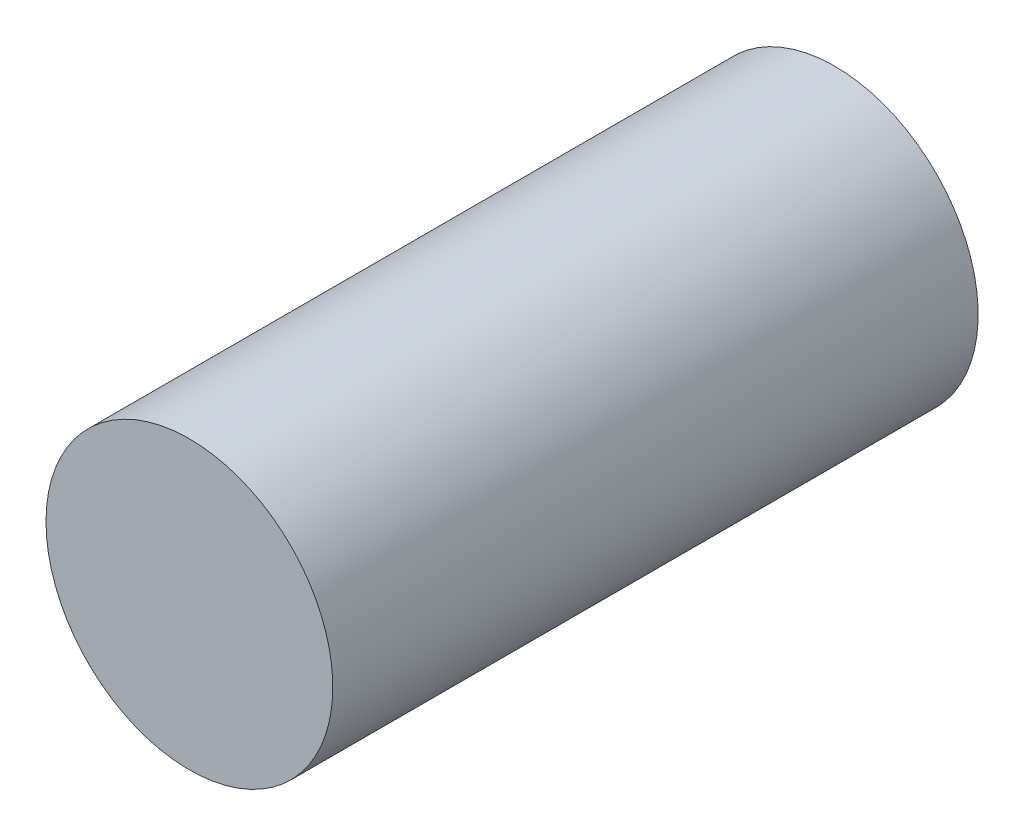
ISO-10303-21;
HEADER;
FILE_DESCRIPTION(('STEP AP214'),'2;1');
FILE_NAME('part.step','',(''),(''),'','','');
FILE_SCHEMA(('AUTOMOTIVE_DESIGN { 1 0 10303 214 1 1 1 1 }'));
ENDSEC;
DATA;
#1=APPLICATION_CONTEXT('core data for automotive mechanical design processes');
#2=APPLICATION_PROTOCOL_DEFINITION('international standard','automotive_design',2000,#1);
#3=PRODUCT_CONTEXT('',#1,'mechanical');
#4=PRODUCT('Part','Part','',(#3));
#5=PRODUCT_RELATED_PRODUCT_CATEGORY('part','',(#4));
#6=PRODUCT_DEFINITION_FORMATION('','',#4);
#7=PRODUCT_DEFINITION_CONTEXT('part definition',#1,'design');
#8=PRODUCT_DEFINITION('design','',#6,#7);
#9=PRODUCT_DEFINITION_SHAPE('','',#8);
#10=(LENGTH_UNIT() NAMED_UNIT(*) SI_UNIT(.MILLI.,.METRE.));
#11=(NAMED_UNIT(*) PLANE_ANGLE_UNIT() SI_UNIT($,.RADIAN.));
#12=(NAMED_UNIT(*) SI_UNIT($,.STERADIAN.) SOLID_ANGLE_UNIT());
#13=UNCERTAINTY_MEASURE_WITH_UNIT(LENGTH_MEASURE(1.E-05),#10,'distance_accuracy_value','');
#14=(GEOMETRIC_REPRESENTATION_CONTEXT(3) GLOBAL_UNCERTAINTY_ASSIGNED_CONTEXT((#13)) GLOBAL_UNIT_ASSIGNED_CONTEXT((#10,
#11,#12)) REPRESENTATION_CONTEXT('',''));
#15=CARTESIAN_POINT('',(0.,0.,0.));
#16=DIRECTION('',(0.,0.,1.));
#17=DIRECTION('',(1.,0.,0.));
#18=AXIS2_PLACEMENT_3D('',#15,#16,#17);
#19=CARTESIAN_POINT('',(0.,0.,45.));
#20=DIRECTION('',(0.,0.,-1.));
#21=DIRECTION('',(-1.,0.,0.));
#22=AXIS2_PLACEMENT_3D('',#19,#20,#21);
#23=CYLINDRICAL_SURFACE('',#22,10.);
#24=CARTESIAN_POINT('',(0.,0.,45.));
#25=DIRECTION('',(0.,0.,1.));
#26=DIRECTION('',(1.,0.,0.));
#27=AXIS2_PLACEMENT_3D('',#24,#25,#26);
#28=CIRCLE('',#27,10.);
#29=CARTESIAN_POINT('',(-10.,0.,45.));
#30=VERTEX_POINT('',#29);
#31=EDGE_CURVE('E10',#30,#30,#28,.T.);
#32=CARTESIAN_POINT('',(0.,0.,0.));
#33=DIRECTION('',(0.,0.,1.));
#34=DIRECTION('',(1.,0.,0.));
#35=AXIS2_PLACEMENT_3D('',#32,#33,#34);
#36=CIRCLE('',#35,10.);
#37=CARTESIAN_POINT('',(-10.,0.,0.));
#38=VERTEX_POINT('',#37);
#39=EDGE_CURVE('E46',#38,#38,#36,.T.);
#40=CARTESIAN_POINT('',(-10.,0.,45.));
#41=CARTESIAN_POINT('',(-10.,0.,44.53125));
#42=CARTESIAN_POINT('',(-10.,0.,44.0625));
#43=CARTESIAN_POINT('',(-10.,0.,43.125));
#44=CARTESIAN_POINT('',(-10.,0.,42.65625));
#45=CARTESIAN_POINT('',(-10.,0.,41.71875));
#46=CARTESIAN_POINT('',(-10.,0.,41.25));
#47=CARTESIAN_POINT('',(-10.,0.,40.3125));
#48=CARTESIAN_POINT('',(-10.,0.,39.84375));
#49=CARTESIAN_POINT('',(-10.,0.,38.90625));
#50=CARTESIAN_POINT('',(-10.,0.,38.4375));
#51=CARTESIAN_POINT('',(-10.,0.,37.5));
#52=CARTESIAN_POINT('',(-10.,0.,37.03125));
#53=CARTESIAN_POINT('',(-10.,0.,36.09375));
#54=CARTESIAN_POINT('',(-10.,0.,35.625));
#55=CARTESIAN_POINT('',(-10.,0.,34.6875));
#56=CARTESIAN_POINT('',(-10.,0.,34.21875));
#57=CARTESIAN_POINT('',(-10.,0.,33.28125));
#58=CARTESIAN_POINT('',(-10.,0.,32.8125));
#59=CARTESIAN_POINT('',(-10.,0.,31.875));
#60=CARTESIAN_POINT('',(-10.,0.,31.40625));
#61=CARTESIAN_POINT('',(-10.,0.,30.46875));
#62=CARTESIAN_POINT('',(-10.,0.,30.));
#63=CARTESIAN_POINT('',(-10.,0.,29.0625));
#64=CARTESIAN_POINT('',(-10.,0.,28.59375));
#65=CARTESIAN_POINT('',(-10.,0.,27.65625));
#66=CARTESIAN_POINT('',(-10.,0.,27.1875));
#67=CARTESIAN_POINT('',(-10.,0.,26.25));
#68=CARTESIAN_POINT('',(-10.,0.,25.78125));
#69=CARTESIAN_POINT('',(-10.,0.,24.84375));
#70=CARTESIAN_POINT('',(-10.,0.,24.375));
#71=CARTESIAN_POINT('',(-10.,0.,23.4375));
#72=CARTESIAN_POINT('',(-10.,0.,22.96875));
#73=CARTESIAN_POINT('',(-10.,0.,22.03125));
#74=CARTESIAN_POINT('',(-10.,0.,21.5625));
#75=CARTESIAN_POINT('',(-10.,0.,20.625));
#76=CARTESIAN_POINT('',(-10.,0.,20.15625));
#77=CARTESIAN_POINT('',(-10.,0.,19.21875));
#78=CARTESIAN_POINT('',(-10.,0.,18.75));
#79=CARTESIAN_POINT('',(-10.,0.,17.8125));
#80=CARTESIAN_POINT('',(-10.,0.,17.34375));
#81=CARTESIAN_POINT('',(-10.,0.,16.40625));
#82=CARTESIAN_POINT('',(-10.,0.,15.9375));
#83=CARTESIAN_POINT('',(-10.,0.,15.));
#84=CARTESIAN_POINT('',(-10.,0.,14.53125));
#85=CARTESIAN_POINT('',(-10.,0.,13.59375));
#86=CARTESIAN_POINT('',(-10.,0.,13.125));
#87=CARTESIAN_POINT('',(-10.,0.,12.1875));
#88=CARTESIAN_POINT('',(-10.,0.,11.71875));
#89=CARTESIAN_POINT('',(-10.,0.,10.78125));
#90=CARTESIAN_POINT('',(-10.,0.,10.3125));
#91=CARTESIAN_POINT('',(-10.,0.,9.375));
#92=CARTESIAN_POINT('',(-10.,0.,8.90625));
#93=CARTESIAN_POINT('',(-10.,0.,7.96874999999999));
#94=CARTESIAN_POINT('',(-10.,0.,7.5));
#95=CARTESIAN_POINT('',(-10.,0.,6.5625));
#96=CARTESIAN_POINT('',(-10.,0.,6.09375));
#97=CARTESIAN_POINT('',(-10.,0.,5.15625));
#98=CARTESIAN_POINT('',(-10.,0.,4.68749999999999));
#99=CARTESIAN_POINT('',(-10.,0.,3.74999999999999));
#100=CARTESIAN_POINT('',(-10.,0.,3.28124999999999));
#101=CARTESIAN_POINT('',(-10.,0.,2.34374999999999));
#102=CARTESIAN_POINT('',(-10.,0.,1.87499999999999));
#103=CARTESIAN_POINT('',(-10.,0.,0.937499999999992));
#104=CARTESIAN_POINT('',(-10.,0.,0.468749999999993));
#105=CARTESIAN_POINT('',(-10.,0.,0.));
#106=B_SPLINE_CURVE_WITH_KNOTS('',3,(#40,#41,#42,#43,#44,#45,#46,#47,#48,#49,#50,#51,#52,#53,
#54,#55,#56,#57,#58,#59,#60,#61,#62,#63,#64,#65,#66,#67,#68,#69,#70,#71,#72,#73,#74,#75,#76,#77,
#78,#79,#80,#81,#82,#83,#84,#85,#86,#87,#88,#89,#90,#91,#92,#93,#94,#95,#96,#97,#98,#99,#100,
#101,#102,#103,#104,#105),.UNSPECIFIED.,.F.,.F.,(4,2,2,2,2,2,2,2,2,2,2,2,2,2,2,2,2,2,2,2,2,2,2,
2,2,2,2,2,2,2,2,2,4),(0.,1.40625,2.8125,4.21875000000001,5.62500000000001,7.03125,8.4375,
9.84375000000001,11.25,12.65625,14.0625,15.46875,16.875,18.28125,19.6875,21.09375,22.5,23.90625,
25.3125,26.71875,28.125,29.53125,30.9375,32.34375,33.75,35.15625,36.5625,37.96875,39.375,
40.78125,42.1875,43.59375,45.),.UNSPECIFIED.);
#107=EDGE_CURVE('BSEAM43',#30,#38,#106,.T.);
#108=ORIENTED_EDGE('',*,*,#31,.F.);
#109=ORIENTED_EDGE('',*,*,#39,.T.);
#110=ORIENTED_EDGE('',*,*,#107,.T.);
#111=ORIENTED_EDGE('',*,*,#107,.F.);
#112=EDGE_LOOP('',(#108,#110,#109,#111));
#113=FACE_BOUND('',#112,.T.);
#114=ADVANCED_FACE('F43',(#113),#23,.T.);
#115=CARTESIAN_POINT('',(0.,0.,45.));
#116=DIRECTION('',(0.,0.,1.));
#117=DIRECTION('',(1.,0.,0.));
#118=AXIS2_PLACEMENT_3D('',#115,#116,#117);
#119=PLANE('',#118);
#120=ORIENTED_EDGE('',*,*,#31,.T.);
#121=EDGE_LOOP('',(#120));
#122=FACE_BOUND('',#121,.T.);
#123=ADVANCED_FACE('F60',(#122),#119,.T.);
#124=CARTESIAN_POINT('',(0.,0.,0.));
#125=DIRECTION('',(0.,0.,1.));
#126=DIRECTION('',(1.,0.,0.));
#127=AXIS2_PLACEMENT_3D('',#124,#125,#126);
#128=PLANE('',#127);
#129=ORIENTED_EDGE('',*,*,#39,.F.);
#130=EDGE_LOOP('',(#129));
#131=FACE_BOUND('',#130,.T.);
#132=ADVANCED_FACE('F58',(#131),#128,.F.);
#133=CLOSED_SHELL('',(#114,#123,#132));
#134=MANIFOLD_SOLID_BREP('B2',#133);
#135=ADVANCED_BREP_SHAPE_REPRESENTATION('',(#18,#134),#14);
#136=SHAPE_DEFINITION_REPRESENTATION(#9,#135);
ENDSEC;
END-ISO-10303-21;
